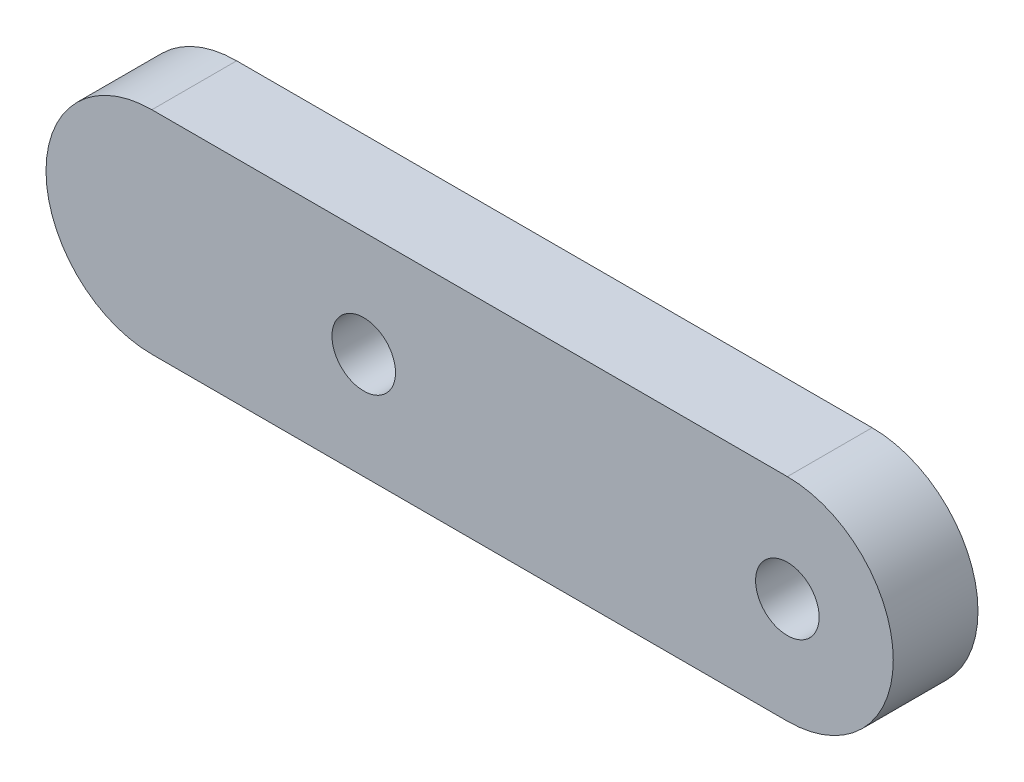
ISO-10303-21;
HEADER;
FILE_DESCRIPTION(('STEP AP214'),'2;1');
FILE_NAME('part.step','',(''),(''),'','','');
FILE_SCHEMA(('AUTOMOTIVE_DESIGN { 1 0 10303 214 1 1 1 1 }'));
ENDSEC;
DATA;
#1=APPLICATION_CONTEXT('core data for automotive mechanical design processes');
#2=APPLICATION_PROTOCOL_DEFINITION('international standard','automotive_design',2000,#1);
#3=PRODUCT_CONTEXT('',#1,'mechanical');
#4=PRODUCT('Part','Part','',(#3));
#5=PRODUCT_RELATED_PRODUCT_CATEGORY('part','',(#4));
#6=PRODUCT_DEFINITION_FORMATION('','',#4);
#7=PRODUCT_DEFINITION_CONTEXT('part definition',#1,'design');
#8=PRODUCT_DEFINITION('design','',#6,#7);
#9=PRODUCT_DEFINITION_SHAPE('','',#8);
#10=(LENGTH_UNIT() NAMED_UNIT(*) SI_UNIT(.MILLI.,.METRE.));
#11=(NAMED_UNIT(*) PLANE_ANGLE_UNIT() SI_UNIT($,.RADIAN.));
#12=(NAMED_UNIT(*) SI_UNIT($,.STERADIAN.) SOLID_ANGLE_UNIT());
#13=UNCERTAINTY_MEASURE_WITH_UNIT(LENGTH_MEASURE(1.E-05),#10,'distance_accuracy_value','');
#14=(GEOMETRIC_REPRESENTATION_CONTEXT(3) GLOBAL_UNCERTAINTY_ASSIGNED_CONTEXT((#13)) GLOBAL_UNIT_ASSIGNED_CONTEXT((#10,
#11,#12)) REPRESENTATION_CONTEXT('',''));
#15=CARTESIAN_POINT('',(0.,0.,0.));
#16=DIRECTION('',(0.,0.,1.));
#17=DIRECTION('',(1.,0.,0.));
#18=AXIS2_PLACEMENT_3D('',#15,#16,#17);
#19=CARTESIAN_POINT('',(15.,0.,4.));
#20=DIRECTION('',(0.,0.,-1.));
#21=DIRECTION('',(-1.,0.,0.));
#22=AXIS2_PLACEMENT_3D('',#19,#20,#21);
#23=PLANE('',#22);
#24=CARTESIAN_POINT('',(15.,0.,4.));
#25=DIRECTION('',(0.,0.,1.));
#26=DIRECTION('',(-1.,0.,0.));
#27=AXIS2_PLACEMENT_3D('',#24,#25,#26);
#28=CIRCLE('',#27,5.00000000000001);
#29=CARTESIAN_POINT('',(15.,-5.00000000000001,4.));
#30=VERTEX_POINT('',#29);
#31=CARTESIAN_POINT('',(15.,5.00000000000001,4.));
#32=VERTEX_POINT('',#31);
#33=EDGE_CURVE('E85',#30,#32,#28,.T.);
#34=ORIENTED_EDGE('',*,*,#33,.T.);
#35=DIRECTION('',(-1.,0.,0.));
#36=VECTOR('',#35,1.);
#37=CARTESIAN_POINT('',(-15.,5.,4.));
#38=LINE('',#37,#36);
#39=CARTESIAN_POINT('',(-15.,5.,4.));
#40=VERTEX_POINT('',#39);
#41=EDGE_CURVE('E80',#32,#40,#38,.T.);
#42=ORIENTED_EDGE('',*,*,#41,.T.);
#43=CARTESIAN_POINT('',(-15.,0.,4.));
#44=DIRECTION('',(0.,0.,1.));
#45=DIRECTION('',(1.,0.,0.));
#46=AXIS2_PLACEMENT_3D('',#43,#44,#45);
#47=CIRCLE('',#46,5.);
#48=CARTESIAN_POINT('',(-15.,-5.,4.));
#49=VERTEX_POINT('',#48);
#50=EDGE_CURVE('E83',#40,#49,#47,.T.);
#51=ORIENTED_EDGE('',*,*,#50,.T.);
#52=DIRECTION('',(1.,0.,0.));
#53=VECTOR('',#52,1.);
#54=CARTESIAN_POINT('',(-15.,-5.,4.));
#55=LINE('',#54,#53);
#56=EDGE_CURVE('E50',#49,#30,#55,.T.);
#57=ORIENTED_EDGE('',*,*,#56,.T.);
#58=EDGE_LOOP('',(#34,#42,#51,#57));
#59=FACE_BOUND('',#58,.T.);
#60=CARTESIAN_POINT('',(15.,0.,4.));
#61=DIRECTION('',(0.,0.,1.));
#62=DIRECTION('',(1.,0.,0.));
#63=AXIS2_PLACEMENT_3D('',#60,#61,#62);
#64=CIRCLE('',#63,1.5);
#65=CARTESIAN_POINT('',(16.5,0.,4.));
#66=VERTEX_POINT('',#65);
#67=EDGE_CURVE('E100',#66,#66,#64,.T.);
#68=ORIENTED_EDGE('',*,*,#67,.F.);
#69=EDGE_LOOP('',(#68));
#70=FACE_BOUND('',#69,.T.);
#71=CARTESIAN_POINT('',(-5.,0.,4.));
#72=DIRECTION('',(0.,0.,1.));
#73=DIRECTION('',(1.,0.,0.));
#74=AXIS2_PLACEMENT_3D('',#71,#72,#73);
#75=CIRCLE('',#74,1.5);
#76=CARTESIAN_POINT('',(-3.5,0.,4.));
#77=VERTEX_POINT('',#76);
#78=EDGE_CURVE('E115',#77,#77,#75,.T.);
#79=ORIENTED_EDGE('',*,*,#78,.F.);
#80=EDGE_LOOP('',(#79));
#81=FACE_BOUND('',#80,.T.);
#82=ADVANCED_FACE('F33',(#59,#70,#81),#23,.F.);
#83=CARTESIAN_POINT('',(15.,0.,0.));
#84=DIRECTION('',(0.,0.,-1.));
#85=DIRECTION('',(-1.,0.,0.));
#86=AXIS2_PLACEMENT_3D('',#83,#84,#85);
#87=PLANE('',#86);
#88=CARTESIAN_POINT('',(15.,0.,0.));
#89=DIRECTION('',(0.,0.,1.));
#90=DIRECTION('',(1.,0.,0.));
#91=AXIS2_PLACEMENT_3D('',#88,#89,#90);
#92=CIRCLE('',#91,1.5);
#93=CARTESIAN_POINT('',(16.5,0.,0.));
#94=VERTEX_POINT('',#93);
#95=EDGE_CURVE('E112',#94,#94,#92,.T.);
#96=ORIENTED_EDGE('',*,*,#95,.T.);
#97=EDGE_LOOP('',(#96));
#98=FACE_BOUND('',#97,.T.);
#99=CARTESIAN_POINT('',(15.,0.,0.));
#100=DIRECTION('',(0.,0.,1.));
#101=DIRECTION('',(-1.,0.,0.));
#102=AXIS2_PLACEMENT_3D('',#99,#100,#101);
#103=CIRCLE('',#102,5.00000000000001);
#104=CARTESIAN_POINT('',(15.,-5.00000000000001,0.));
#105=VERTEX_POINT('',#104);
#106=CARTESIAN_POINT('',(15.,5.00000000000001,0.));
#107=VERTEX_POINT('',#106);
#108=EDGE_CURVE('E97',#105,#107,#103,.T.);
#109=ORIENTED_EDGE('',*,*,#108,.F.);
#110=DIRECTION('',(1.,0.,0.));
#111=VECTOR('',#110,1.);
#112=CARTESIAN_POINT('',(-15.,-5.,0.));
#113=LINE('',#112,#111);
#114=CARTESIAN_POINT('',(-15.,-5.,0.));
#115=VERTEX_POINT('',#114);
#116=EDGE_CURVE('E73',#115,#105,#113,.T.);
#117=ORIENTED_EDGE('',*,*,#116,.F.);
#118=CARTESIAN_POINT('',(-15.,0.,0.));
#119=DIRECTION('',(0.,0.,1.));
#120=DIRECTION('',(1.,0.,0.));
#121=AXIS2_PLACEMENT_3D('',#118,#119,#120);
#122=CIRCLE('',#121,5.);
#123=CARTESIAN_POINT('',(-15.,5.,0.));
#124=VERTEX_POINT('',#123);
#125=EDGE_CURVE('E67',#124,#115,#122,.T.);
#126=ORIENTED_EDGE('',*,*,#125,.F.);
#127=DIRECTION('',(-1.,0.,0.));
#128=VECTOR('',#127,1.);
#129=CARTESIAN_POINT('',(-15.,5.,0.));
#130=LINE('',#129,#128);
#131=EDGE_CURVE('E89',#107,#124,#130,.T.);
#132=ORIENTED_EDGE('',*,*,#131,.F.);
#133=EDGE_LOOP('',(#109,#117,#126,#132));
#134=FACE_BOUND('',#133,.T.);
#135=CARTESIAN_POINT('',(-5.,0.,0.));
#136=DIRECTION('',(0.,0.,1.));
#137=DIRECTION('',(1.,0.,0.));
#138=AXIS2_PLACEMENT_3D('',#135,#136,#137);
#139=CIRCLE('',#138,1.5);
#140=CARTESIAN_POINT('',(-3.5,0.,0.));
#141=VERTEX_POINT('',#140);
#142=EDGE_CURVE('E118',#141,#141,#139,.T.);
#143=ORIENTED_EDGE('',*,*,#142,.T.);
#144=EDGE_LOOP('',(#143));
#145=FACE_BOUND('',#144,.T.);
#146=ADVANCED_FACE('F108',(#98,#134,#145),#87,.T.);
#147=CARTESIAN_POINT('',(15.,0.,4.));
#148=DIRECTION('',(0.,0.,-1.));
#149=DIRECTION('',(-1.,0.,0.));
#150=AXIS2_PLACEMENT_3D('',#147,#148,#149);
#151=CYLINDRICAL_SURFACE('',#150,5.00000000000001);
#152=ORIENTED_EDGE('',*,*,#108,.T.);
#153=DIRECTION('',(0.,0.,-1.));
#154=VECTOR('',#153,1.);
#155=CARTESIAN_POINT('',(15.,5.00000000000001,4.));
#156=LINE('',#155,#154);
#157=EDGE_CURVE('E11',#32,#107,#156,.T.);
#158=ORIENTED_EDGE('',*,*,#157,.F.);
#159=ORIENTED_EDGE('',*,*,#33,.F.);
#160=DIRECTION('',(0.,0.,-1.));
#161=VECTOR('',#160,1.);
#162=CARTESIAN_POINT('',(15.,-5.00000000000001,4.));
#163=LINE('',#162,#161);
#164=EDGE_CURVE('E93',#30,#105,#163,.T.);
#165=ORIENTED_EDGE('',*,*,#164,.T.);
#166=EDGE_LOOP('',(#152,#158,#159,#165));
#167=FACE_BOUND('',#166,.T.);
#168=ADVANCED_FACE('F35',(#167),#151,.T.);
#169=CARTESIAN_POINT('',(-15.,5.,4.));
#170=DIRECTION('',(0.,-1.,0.));
#171=DIRECTION('',(1.,0.,0.));
#172=AXIS2_PLACEMENT_3D('',#169,#170,#171);
#173=PLANE('',#172);
#174=ORIENTED_EDGE('',*,*,#131,.T.);
#175=DIRECTION('',(0.,0.,-1.));
#176=VECTOR('',#175,1.);
#177=CARTESIAN_POINT('',(-15.,5.,4.));
#178=LINE('',#177,#176);
#179=EDGE_CURVE('E42',#40,#124,#178,.T.);
#180=ORIENTED_EDGE('',*,*,#179,.F.);
#181=ORIENTED_EDGE('',*,*,#41,.F.);
#182=ORIENTED_EDGE('',*,*,#157,.T.);
#183=EDGE_LOOP('',(#174,#180,#181,#182));
#184=FACE_BOUND('',#183,.T.);
#185=ADVANCED_FACE('F88',(#184),#173,.F.);
#186=CARTESIAN_POINT('',(-15.,0.,4.));
#187=DIRECTION('',(0.,0.,-1.));
#188=DIRECTION('',(-1.,0.,0.));
#189=AXIS2_PLACEMENT_3D('',#186,#187,#188);
#190=CYLINDRICAL_SURFACE('',#189,5.);
#191=ORIENTED_EDGE('',*,*,#125,.T.);
#192=DIRECTION('',(0.,0.,-1.));
#193=VECTOR('',#192,1.);
#194=CARTESIAN_POINT('',(-15.,-5.,4.));
#195=LINE('',#194,#193);
#196=EDGE_CURVE('E90',#49,#115,#195,.T.);
#197=ORIENTED_EDGE('',*,*,#196,.F.);
#198=ORIENTED_EDGE('',*,*,#50,.F.);
#199=ORIENTED_EDGE('',*,*,#179,.T.);
#200=EDGE_LOOP('',(#191,#197,#198,#199));
#201=FACE_BOUND('',#200,.T.);
#202=ADVANCED_FACE('F91',(#201),#190,.T.);
#203=CARTESIAN_POINT('',(-15.,-5.,4.));
#204=DIRECTION('',(0.,1.,0.));
#205=DIRECTION('',(-1.,0.,0.));
#206=AXIS2_PLACEMENT_3D('',#203,#204,#205);
#207=PLANE('',#206);
#208=ORIENTED_EDGE('',*,*,#116,.T.);
#209=ORIENTED_EDGE('',*,*,#164,.F.);
#210=ORIENTED_EDGE('',*,*,#56,.F.);
#211=ORIENTED_EDGE('',*,*,#196,.T.);
#212=EDGE_LOOP('',(#208,#209,#210,#211));
#213=FACE_BOUND('',#212,.T.);
#214=ADVANCED_FACE('F105',(#213),#207,.F.);
#215=CARTESIAN_POINT('',(15.,0.,4.));
#216=DIRECTION('',(0.,0.,-1.));
#217=DIRECTION('',(-1.,0.,0.));
#218=AXIS2_PLACEMENT_3D('',#215,#216,#217);
#219=CYLINDRICAL_SURFACE('',#218,1.5);
#220=ORIENTED_EDGE('',*,*,#67,.T.);
#221=EDGE_LOOP('',(#220));
#222=FACE_BOUND('',#221,.T.);
#223=ORIENTED_EDGE('',*,*,#95,.F.);
#224=EDGE_LOOP('',(#223));
#225=FACE_BOUND('',#224,.T.);
#226=ADVANCED_FACE('F135',(#222,#225),#219,.F.);
#227=CARTESIAN_POINT('',(-5.,0.,4.));
#228=DIRECTION('',(0.,0.,-1.));
#229=DIRECTION('',(-1.,0.,0.));
#230=AXIS2_PLACEMENT_3D('',#227,#228,#229);
#231=CYLINDRICAL_SURFACE('',#230,1.5);
#232=ORIENTED_EDGE('',*,*,#78,.T.);
#233=EDGE_LOOP('',(#232));
#234=FACE_BOUND('',#233,.T.);
#235=ORIENTED_EDGE('',*,*,#142,.F.);
#236=EDGE_LOOP('',(#235));
#237=FACE_BOUND('',#236,.T.);
#238=ADVANCED_FACE('F124',(#234,#237),#231,.F.);
#239=CLOSED_SHELL('',(#82,#146,#168,#185,#202,#214,#226,#238));
#240=MANIFOLD_SOLID_BREP('B2',#239);
#241=ADVANCED_BREP_SHAPE_REPRESENTATION('',(#18,#240),#14);
#242=SHAPE_DEFINITION_REPRESENTATION(#9,#241);
ENDSEC;
END-ISO-10303-21;
